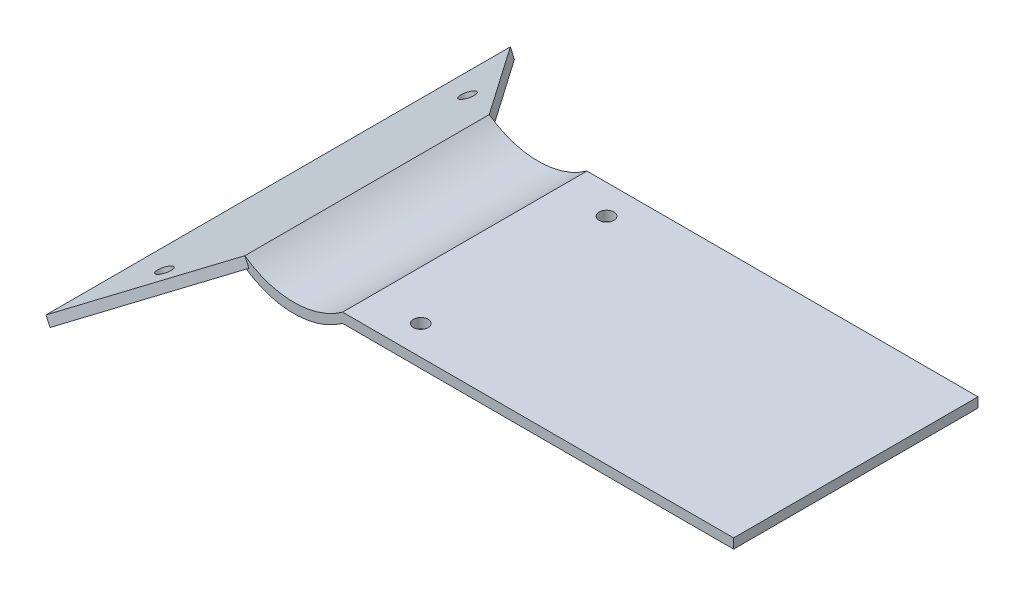
ISO-10303-21;
HEADER;
FILE_DESCRIPTION(('STEP AP214'),'2;1');
FILE_NAME('part.step','',(''),(''),'','','');
FILE_SCHEMA(('AUTOMOTIVE_DESIGN { 1 0 10303 214 1 1 1 1 }'));
ENDSEC;
DATA;
#1=APPLICATION_CONTEXT('core data for automotive mechanical design processes');
#2=APPLICATION_PROTOCOL_DEFINITION('international standard','automotive_design',2000,#1);
#3=PRODUCT_CONTEXT('',#1,'mechanical');
#4=PRODUCT('Part','Part','',(#3));
#5=PRODUCT_RELATED_PRODUCT_CATEGORY('part','',(#4));
#6=PRODUCT_DEFINITION_FORMATION('','',#4);
#7=PRODUCT_DEFINITION_CONTEXT('part definition',#1,'design');
#8=PRODUCT_DEFINITION('design','',#6,#7);
#9=PRODUCT_DEFINITION_SHAPE('','',#8);
#10=(LENGTH_UNIT() NAMED_UNIT(*) SI_UNIT(.MILLI.,.METRE.));
#11=(NAMED_UNIT(*) PLANE_ANGLE_UNIT() SI_UNIT($,.RADIAN.));
#12=(NAMED_UNIT(*) SI_UNIT($,.STERADIAN.) SOLID_ANGLE_UNIT());
#13=UNCERTAINTY_MEASURE_WITH_UNIT(LENGTH_MEASURE(1.E-05),#10,'distance_accuracy_value','');
#14=(GEOMETRIC_REPRESENTATION_CONTEXT(3) GLOBAL_UNCERTAINTY_ASSIGNED_CONTEXT((#13)) GLOBAL_UNIT_ASSIGNED_CONTEXT((#10,
#11,#12)) REPRESENTATION_CONTEXT('',''));
#15=CARTESIAN_POINT('',(0.,0.,0.));
#16=DIRECTION('',(0.,0.,1.));
#17=DIRECTION('',(1.,0.,0.));
#18=AXIS2_PLACEMENT_3D('',#15,#16,#17);
#19=CARTESIAN_POINT('',(-215.409015853351,9.9999999999999,500.));
#20=DIRECTION('',(0.,-1.,0.));
#21=DIRECTION('',(1.,0.,0.));
#22=AXIS2_PLACEMENT_3D('',#19,#20,#21);
#23=PLANE('',#22);
#24=DIRECTION('',(-1.,0.,0.));
#25=VECTOR('',#24,1.);
#26=CARTESIAN_POINT('',(-215.409015853351,9.9999999999999,0.));
#27=LINE('',#26,#25);
#28=CARTESIAN_POINT('',(400.,10.,0.));
#29=VERTEX_POINT('',#28);
#30=CARTESIAN_POINT('',(-400.,9.99999999999988,0.));
#31=VERTEX_POINT('',#30);
#32=EDGE_CURVE('E128',#29,#31,#27,.T.);
#33=ORIENTED_EDGE('',*,*,#32,.T.);
#34=DIRECTION('',(0.,0.,-1.));
#35=VECTOR('',#34,1.);
#36=CARTESIAN_POINT('',(-400.,9.99999999999988,500.));
#37=LINE('',#36,#35);
#38=CARTESIAN_POINT('',(-400.,9.99999999999988,500.));
#39=VERTEX_POINT('',#38);
#40=EDGE_CURVE('E160',#39,#31,#37,.T.);
#41=ORIENTED_EDGE('',*,*,#40,.F.);
#42=DIRECTION('',(-1.,0.,0.));
#43=VECTOR('',#42,1.);
#44=CARTESIAN_POINT('',(-215.409015853351,9.9999999999999,500.));
#45=LINE('',#44,#43);
#46=CARTESIAN_POINT('',(400.,10.,500.));
#47=VERTEX_POINT('',#46);
#48=EDGE_CURVE('E84',#47,#39,#45,.T.);
#49=ORIENTED_EDGE('',*,*,#48,.F.);
#50=DIRECTION('',(0.,0.,-1.));
#51=VECTOR('',#50,1.);
#52=CARTESIAN_POINT('',(400.,10.,500.));
#53=LINE('',#52,#51);
#54=EDGE_CURVE('E123',#47,#29,#53,.T.);
#55=ORIENTED_EDGE('',*,*,#54,.T.);
#56=EDGE_LOOP('',(#33,#41,#49,#55));
#57=FACE_BOUND('',#56,.T.);
#58=CARTESIAN_POINT('',(-300.,9.99999999999989,60.));
#59=DIRECTION('',(0.,1.,0.));
#60=DIRECTION('',(-1.,0.,0.));
#61=AXIS2_PLACEMENT_3D('',#58,#59,#60);
#62=CIRCLE('',#61,15.);
#63=CARTESIAN_POINT('',(-315.,9.99999999999989,60.));
#64=VERTEX_POINT('',#63);
#65=EDGE_CURVE('E165',#64,#64,#62,.T.);
#66=ORIENTED_EDGE('',*,*,#65,.F.);
#67=EDGE_LOOP('',(#66));
#68=FACE_BOUND('',#67,.T.);
#69=CARTESIAN_POINT('',(-300.,9.99999999999989,440.));
#70=DIRECTION('',(0.,1.,0.));
#71=DIRECTION('',(-1.,0.,0.));
#72=AXIS2_PLACEMENT_3D('',#69,#70,#71);
#73=CIRCLE('',#72,15.);
#74=CARTESIAN_POINT('',(-315.,9.99999999999989,440.));
#75=VERTEX_POINT('',#74);
#76=EDGE_CURVE('E176',#75,#75,#73,.F.);
#77=ORIENTED_EDGE('',*,*,#76,.T.);
#78=EDGE_LOOP('',(#77));
#79=FACE_BOUND('',#78,.T.);
#80=ADVANCED_FACE('F33',(#57,#68,#79),#23,.F.);
#81=CARTESIAN_POINT('',(-215.409015853351,-10.,500.));
#82=DIRECTION('',(0.,-1.,0.));
#83=DIRECTION('',(1.,0.,0.));
#84=AXIS2_PLACEMENT_3D('',#81,#82,#83);
#85=PLANE('',#84);
#86=DIRECTION('',(-1.,0.,0.));
#87=VECTOR('',#86,1.);
#88=CARTESIAN_POINT('',(-215.409015853351,-10.,0.));
#89=LINE('',#88,#87);
#90=CARTESIAN_POINT('',(400.,-9.99999999999993,0.));
#91=VERTEX_POINT('',#90);
#92=CARTESIAN_POINT('',(-400.,-10.,0.));
#93=VERTEX_POINT('',#92);
#94=EDGE_CURVE('E144',#91,#93,#89,.T.);
#95=ORIENTED_EDGE('',*,*,#94,.F.);
#96=DIRECTION('',(0.,0.,-1.));
#97=VECTOR('',#96,1.);
#98=CARTESIAN_POINT('',(400.,-9.99999999999993,500.));
#99=LINE('',#98,#97);
#100=CARTESIAN_POINT('',(400.,-9.99999999999993,500.));
#101=VERTEX_POINT('',#100);
#102=EDGE_CURVE('E75',#101,#91,#99,.T.);
#103=ORIENTED_EDGE('',*,*,#102,.F.);
#104=DIRECTION('',(-1.,0.,0.));
#105=VECTOR('',#104,1.);
#106=CARTESIAN_POINT('',(-215.409015853351,-10.,500.));
#107=LINE('',#106,#105);
#108=CARTESIAN_POINT('',(-400.,-10.,500.));
#109=VERTEX_POINT('',#108);
#110=EDGE_CURVE('E101',#101,#109,#107,.T.);
#111=ORIENTED_EDGE('',*,*,#110,.T.);
#112=DIRECTION('',(0.,0.,-1.));
#113=VECTOR('',#112,1.);
#114=CARTESIAN_POINT('',(-400.,-10.,500.));
#115=LINE('',#114,#113);
#116=EDGE_CURVE('E110',#109,#93,#115,.T.);
#117=ORIENTED_EDGE('',*,*,#116,.T.);
#118=EDGE_LOOP('',(#95,#103,#111,#117));
#119=FACE_BOUND('',#118,.T.);
#120=CARTESIAN_POINT('',(-300.,-10.,60.));
#121=DIRECTION('',(0.,-1.,0.));
#122=DIRECTION('',(1.,0.,0.));
#123=AXIS2_PLACEMENT_3D('',#120,#121,#122);
#124=CIRCLE('',#123,15.);
#125=CARTESIAN_POINT('',(-285.,-10.,60.));
#126=VERTEX_POINT('',#125);
#127=EDGE_CURVE('E162',#126,#126,#124,.T.);
#128=ORIENTED_EDGE('',*,*,#127,.F.);
#129=EDGE_LOOP('',(#128));
#130=FACE_BOUND('',#129,.T.);
#131=CARTESIAN_POINT('',(-300.,-10.,440.));
#132=DIRECTION('',(0.,-1.,0.));
#133=DIRECTION('',(1.,0.,0.));
#134=AXIS2_PLACEMENT_3D('',#131,#132,#133);
#135=CIRCLE('',#134,15.);
#136=CARTESIAN_POINT('',(-285.,-10.,440.));
#137=VERTEX_POINT('',#136);
#138=EDGE_CURVE('E36',#137,#137,#135,.F.);
#139=ORIENTED_EDGE('',*,*,#138,.T.);
#140=EDGE_LOOP('',(#139));
#141=FACE_BOUND('',#140,.T.);
#142=ADVANCED_FACE('F120',(#119,#130,#141),#85,.T.);
#143=CARTESIAN_POINT('',(-215.409015853351,-969.886426697641,0.));
#144=DIRECTION('',(0.,0.,1.));
#145=DIRECTION('',(1.,0.,0.));
#146=AXIS2_PLACEMENT_3D('',#143,#144,#145);
#147=PLANE('',#146);
#148=DIRECTION('',(-0.416666666666667,0.909059342886309,0.));
#149=VECTOR('',#148,1.);
#150=CARTESIAN_POINT('',(-773.478535243929,-91.5145201910597,0.));
#151=LINE('',#150,#149);
#152=CARTESIAN_POINT('',(-774.236374053209,-89.8611111111113,0.));
#153=VERTEX_POINT('',#152);
#154=CARTESIAN_POINT('',(-781.811868577262,-73.3333333333335,0.));
#155=VERTEX_POINT('',#154);
#156=EDGE_CURVE('E11',#153,#155,#151,.T.);
#157=ORIENTED_EDGE('',*,*,#156,.F.);
#158=DIRECTION('',(-0.90905934288631,-0.416666666666667,0.));
#159=VECTOR('',#158,1.);
#160=CARTESIAN_POINT('',(-645.759002392385,-30.9736043593051,0.));
#161=LINE('',#160,#159);
#162=CARTESIAN_POINT('',(-818.174242292714,-110.,0.));
#163=VERTEX_POINT('',#162);
#164=EDGE_CURVE('E138',#153,#163,#161,.T.);
#165=ORIENTED_EDGE('',*,*,#164,.T.);
#166=DIRECTION('',(-0.704154339142587,-0.710046946804693,0.));
#167=VECTOR('',#166,1.);
#168=CARTESIAN_POINT('',(-949.231435355701,-242.153925096134,0.));
#169=LINE('',#168,#167);
#170=EDGE_CURVE('E135',#155,#163,#169,.T.);
#171=ORIENTED_EDGE('',*,*,#170,.F.);
#172=EDGE_LOOP('',(#157,#165,#171));
#173=FACE_BOUND('',#172,.T.);
#174=ADVANCED_FACE('F261',(#173),#147,.F.);
#175=DIRECTION('',(-0.909059342886309,-0.416666666666667,0.));
#176=VECTOR('',#175,1.);
#177=CARTESIAN_POINT('',(-1368.37615592177,-364.185397571579,0.));
#178=LINE('',#177,#176);
#179=CARTESIAN_POINT('',(-591.666666666667,-8.18118685772623,0.));
#180=VERTEX_POINT('',#179);
#181=CARTESIAN_POINT('',(-598.299201498949,-11.2212042138465,0.));
#182=VERTEX_POINT('',#181);
#183=EDGE_CURVE('E190',#180,#182,#178,.T.);
#184=ORIENTED_EDGE('',*,*,#183,.F.);
#185=DIRECTION('',(-0.416666666666667,0.909059342886309,0.));
#186=VECTOR('',#185,1.);
#187=CARTESIAN_POINT('',(-591.666666666667,-8.18118685772623,0.));
#188=LINE('',#187,#186);
#189=CARTESIAN_POINT('',(-600.,9.9999999999999,0.));
#190=VERTEX_POINT('',#189);
#191=EDGE_CURVE('E198',#180,#190,#188,.T.);
#192=ORIENTED_EDGE('',*,*,#191,.T.);
#193=CARTESIAN_POINT('',(-500.,147.477270848675,0.));
#194=DIRECTION('',(0.,0.,1.));
#195=DIRECTION('',(1.,0.,0.));
#196=AXIS2_PLACEMENT_3D('',#193,#194,#195);
#197=CIRCLE('',#196,170.);
#198=EDGE_CURVE('E131',#190,#31,#197,.T.);
#199=ORIENTED_EDGE('',*,*,#198,.T.);
#200=ORIENTED_EDGE('',*,*,#32,.F.);
#201=DIRECTION('',(0.,1.,0.));
#202=VECTOR('',#201,1.);
#203=CARTESIAN_POINT('',(400.,-969.886426697641,0.));
#204=LINE('',#203,#202);
#205=EDGE_CURVE('E78',#91,#29,#204,.T.);
#206=ORIENTED_EDGE('',*,*,#205,.F.);
#207=ORIENTED_EDGE('',*,*,#94,.T.);
#208=CARTESIAN_POINT('',(-500.,127.477270848675,0.));
#209=DIRECTION('',(0.,0.,1.));
#210=DIRECTION('',(1.,0.,0.));
#211=AXIS2_PLACEMENT_3D('',#208,#209,#210);
#212=CIRCLE('',#211,170.);
#213=EDGE_CURVE('E114',#182,#93,#212,.T.);
#214=ORIENTED_EDGE('',*,*,#213,.F.);
#215=EDGE_LOOP('',(#184,#192,#199,#200,#206,#207,#214));
#216=FACE_BOUND('',#215,.T.);
#217=ADVANCED_FACE('F309',(#216),#147,.F.);
#218=CARTESIAN_POINT('',(-215.409015853351,-969.886426697641,500.));
#219=DIRECTION('',(0.,0.,1.));
#220=DIRECTION('',(1.,0.,0.));
#221=AXIS2_PLACEMENT_3D('',#218,#219,#220);
#222=PLANE('',#221);
#223=DIRECTION('',(-0.90905934288631,-0.416666666666667,0.));
#224=VECTOR('',#223,1.);
#225=CARTESIAN_POINT('',(-645.759002392385,-30.9736043593051,500.));
#226=LINE('',#225,#224);
#227=CARTESIAN_POINT('',(-774.236374053209,-89.8611111111113,500.));
#228=VERTEX_POINT('',#227);
#229=CARTESIAN_POINT('',(-818.174242292714,-110.,500.));
#230=VERTEX_POINT('',#229);
#231=EDGE_CURVE('E238',#228,#230,#226,.T.);
#232=ORIENTED_EDGE('',*,*,#231,.F.);
#233=DIRECTION('',(-0.416666666666667,0.909059342886309,0.));
#234=VECTOR('',#233,1.);
#235=CARTESIAN_POINT('',(-773.478535243929,-91.5145201910596,500.));
#236=LINE('',#235,#234);
#237=CARTESIAN_POINT('',(-781.811868577262,-73.3333333333335,500.));
#238=VERTEX_POINT('',#237);
#239=EDGE_CURVE('E161',#228,#238,#236,.T.);
#240=ORIENTED_EDGE('',*,*,#239,.T.);
#241=DIRECTION('',(-0.704154339142587,-0.710046946804693,0.));
#242=VECTOR('',#241,1.);
#243=CARTESIAN_POINT('',(-949.231435355701,-242.153925096134,500.));
#244=LINE('',#243,#242);
#245=EDGE_CURVE('E236',#238,#230,#244,.T.);
#246=ORIENTED_EDGE('',*,*,#245,.T.);
#247=EDGE_LOOP('',(#232,#240,#246));
#248=FACE_BOUND('',#247,.T.);
#249=ADVANCED_FACE('F252',(#248),#222,.T.);
#250=CARTESIAN_POINT('',(-500.,147.477270848675,500.));
#251=DIRECTION('',(0.,0.,-1.));
#252=DIRECTION('',(-1.,0.,0.));
#253=AXIS2_PLACEMENT_3D('',#250,#251,#252);
#254=CYLINDRICAL_SURFACE('',#253,170.);
#255=ORIENTED_EDGE('',*,*,#198,.F.);
#256=DIRECTION('',(0.,0.,-1.));
#257=VECTOR('',#256,1.);
#258=CARTESIAN_POINT('',(-600.,9.9999999999999,500.));
#259=LINE('',#258,#257);
#260=CARTESIAN_POINT('',(-600.,9.99999999999995,500.));
#261=VERTEX_POINT('',#260);
#262=EDGE_CURVE('E157',#261,#190,#259,.T.);
#263=ORIENTED_EDGE('',*,*,#262,.F.);
#264=CARTESIAN_POINT('',(-500.,147.477270848675,500.));
#265=DIRECTION('',(0.,0.,1.));
#266=DIRECTION('',(1.,0.,0.));
#267=AXIS2_PLACEMENT_3D('',#264,#265,#266);
#268=CIRCLE('',#267,170.);
#269=EDGE_CURVE('E233',#261,#39,#268,.T.);
#270=ORIENTED_EDGE('',*,*,#269,.T.);
#271=ORIENTED_EDGE('',*,*,#40,.T.);
#272=EDGE_LOOP('',(#255,#263,#270,#271));
#273=FACE_BOUND('',#272,.T.);
#274=ADVANCED_FACE('F340',(#273),#254,.F.);
#275=CARTESIAN_POINT('',(-653.334496916438,-14.4458265815273,500.));
#276=DIRECTION('',(0.416666666666667,-0.909059342886309,0.));
#277=DIRECTION('',(0.909059342886309,0.416666666666667,0.));
#278=AXIS2_PLACEMENT_3D('',#275,#276,#277);
#279=PLANE('',#278);
#280=ORIENTED_EDGE('',*,*,#262,.T.);
#281=DIRECTION('',(-0.603946154764153,-0.276818266179133,-0.74740931868366));
#282=VECTOR('',#281,1.);
#283=CARTESIAN_POINT('',(-813.752809149338,-87.973439441378,-264.52828649172));
#284=LINE('',#283,#282);
#285=CARTESIAN_POINT('',(-781.811868577262,-73.3333333333335,-225.));
#286=VERTEX_POINT('',#285);
#287=EDGE_CURVE('E169',#190,#286,#284,.T.);
#288=ORIENTED_EDGE('',*,*,#287,.T.);
#289=DIRECTION('',(0.,0.,1.));
#290=VECTOR('',#289,1.);
#291=CARTESIAN_POINT('',(-781.811868577262,-73.3333333333335,285.937358889559));
#292=LINE('',#291,#290);
#293=EDGE_CURVE('E183',#286,#155,#292,.T.);
#294=ORIENTED_EDGE('',*,*,#293,.T.);
#295=DIRECTION('',(0.,0.,-1.));
#296=VECTOR('',#295,1.);
#297=CARTESIAN_POINT('',(-781.811868577262,-73.3333333333335,500.));
#298=LINE('',#297,#296);
#299=EDGE_CURVE('E154',#238,#155,#298,.T.);
#300=ORIENTED_EDGE('',*,*,#299,.F.);
#301=DIRECTION('',(0.,0.,-1.));
#302=VECTOR('',#301,1.);
#303=CARTESIAN_POINT('',(-781.811868577262,-73.3333333333336,285.937358889559));
#304=LINE('',#303,#302);
#305=CARTESIAN_POINT('',(-781.811868577262,-73.3333333333335,725.));
#306=VERTEX_POINT('',#305);
#307=EDGE_CURVE('E221',#306,#238,#304,.T.);
#308=ORIENTED_EDGE('',*,*,#307,.F.);
#309=DIRECTION('',(-0.603946154764153,-0.276818266179133,0.74740931868366));
#310=VECTOR('',#309,1.);
#311=CARTESIAN_POINT('',(-846.19669623512,-102.844070706023,804.678990906262));
#312=LINE('',#311,#310);
#313=EDGE_CURVE('E200',#261,#306,#312,.T.);
#314=ORIENTED_EDGE('',*,*,#313,.F.);
#315=EDGE_LOOP('',(#280,#288,#294,#300,#308,#314));
#316=FACE_BOUND('',#315,.T.);
#317=CARTESIAN_POINT('',(-704.541824431926,-37.9166666666667,560.));
#318=DIRECTION('',(-0.416666666666667,0.909059342886309,0.));
#319=DIRECTION('',(-0.909059342886309,-0.416666666666667,0.));
#320=AXIS2_PLACEMENT_3D('',#317,#318,#319);
#321=CIRCLE('',#320,15.0000000000001);
#322=CARTESIAN_POINT('',(-718.17771457522,-44.1666666666668,560.));
#323=VERTEX_POINT('',#322);
#324=EDGE_CURVE('E209',#323,#323,#321,.F.);
#325=ORIENTED_EDGE('',*,*,#324,.T.);
#326=EDGE_LOOP('',(#325));
#327=FACE_BOUND('',#326,.T.);
#328=CARTESIAN_POINT('',(-704.541824431926,-37.9166666666668,-60.));
#329=DIRECTION('',(-0.416666666666667,0.909059342886309,0.));
#330=DIRECTION('',(-0.909059342886309,-0.416666666666667,0.));
#331=AXIS2_PLACEMENT_3D('',#328,#329,#330);
#332=CIRCLE('',#331,15.0000000000001);
#333=CARTESIAN_POINT('',(-718.177714575221,-44.1666666666669,-60.));
#334=VERTEX_POINT('',#333);
#335=EDGE_CURVE('E164',#334,#334,#332,.T.);
#336=ORIENTED_EDGE('',*,*,#335,.F.);
#337=EDGE_LOOP('',(#336));
#338=FACE_BOUND('',#337,.T.);
#339=ADVANCED_FACE('F338',(#316,#327,#338),#279,.F.);
#340=CARTESIAN_POINT('',(-949.231435355701,-242.153925096134,500.));
#341=DIRECTION('',(0.710046946804693,-0.704154339142587,0.));
#342=DIRECTION('',(0.704154339142587,0.710046946804693,0.));
#343=AXIS2_PLACEMENT_3D('',#340,#341,#342);
#344=PLANE('',#343);
#345=ORIENTED_EDGE('',*,*,#170,.T.);
#346=DIRECTION('',(0.,0.,-1.));
#347=VECTOR('',#346,1.);
#348=CARTESIAN_POINT('',(-818.174242292714,-110.,500.));
#349=LINE('',#348,#347);
#350=EDGE_CURVE('E151',#230,#163,#349,.T.);
#351=ORIENTED_EDGE('',*,*,#350,.F.);
#352=ORIENTED_EDGE('',*,*,#245,.F.);
#353=ORIENTED_EDGE('',*,*,#299,.T.);
#354=EDGE_LOOP('',(#345,#351,#352,#353));
#355=FACE_BOUND('',#354,.T.);
#356=ADVANCED_FACE('F256',(#355),#344,.F.);
#357=CARTESIAN_POINT('',(-645.759002392385,-30.9736043593051,500.));
#358=DIRECTION('',(0.416666666666667,-0.90905934288631,0.));
#359=DIRECTION('',(0.90905934288631,0.416666666666667,0.));
#360=AXIS2_PLACEMENT_3D('',#357,#358,#359);
#361=PLANE('',#360);
#362=CARTESIAN_POINT('',(-600.,-10.,0.));
#363=VERTEX_POINT('',#362);
#364=EDGE_CURVE('E139',#363,#153,#161,.T.);
#365=ORIENTED_EDGE('',*,*,#364,.F.);
#366=DIRECTION('',(0.,0.,-1.));
#367=VECTOR('',#366,1.);
#368=CARTESIAN_POINT('',(-600.,-10.,500.));
#369=LINE('',#368,#367);
#370=CARTESIAN_POINT('',(-600.,-10.,500.));
#371=VERTEX_POINT('',#370);
#372=EDGE_CURVE('E118',#371,#363,#369,.T.);
#373=ORIENTED_EDGE('',*,*,#372,.F.);
#374=EDGE_CURVE('E107',#371,#228,#226,.T.);
#375=ORIENTED_EDGE('',*,*,#374,.T.);
#376=ORIENTED_EDGE('',*,*,#231,.T.);
#377=ORIENTED_EDGE('',*,*,#350,.T.);
#378=ORIENTED_EDGE('',*,*,#164,.F.);
#379=EDGE_LOOP('',(#365,#373,#375,#376,#377,#378));
#380=FACE_BOUND('',#379,.T.);
#381=ADVANCED_FACE('F246',(#380),#361,.T.);
#382=CARTESIAN_POINT('',(-500.,127.477270848675,500.));
#383=DIRECTION('',(0.,0.,-1.));
#384=DIRECTION('',(-1.,0.,0.));
#385=AXIS2_PLACEMENT_3D('',#382,#383,#384);
#386=CYLINDRICAL_SURFACE('',#385,170.);
#387=EDGE_CURVE('E142',#363,#182,#212,.T.);
#388=ORIENTED_EDGE('',*,*,#387,.T.);
#389=ORIENTED_EDGE('',*,*,#213,.T.);
#390=ORIENTED_EDGE('',*,*,#116,.F.);
#391=CARTESIAN_POINT('',(-500.,127.477270848675,500.));
#392=DIRECTION('',(0.,0.,1.));
#393=DIRECTION('',(1.,0.,0.));
#394=AXIS2_PLACEMENT_3D('',#391,#392,#393);
#395=CIRCLE('',#394,170.);
#396=CARTESIAN_POINT('',(-598.299201498949,-11.2212042138465,500.));
#397=VERTEX_POINT('',#396);
#398=EDGE_CURVE('E96',#397,#109,#395,.T.);
#399=ORIENTED_EDGE('',*,*,#398,.F.);
#400=EDGE_CURVE('E106',#371,#397,#395,.T.);
#401=ORIENTED_EDGE('',*,*,#400,.F.);
#402=ORIENTED_EDGE('',*,*,#372,.T.);
#403=EDGE_LOOP('',(#388,#389,#390,#399,#401,#402));
#404=FACE_BOUND('',#403,.T.);
#405=ADVANCED_FACE('F112',(#404),#386,.T.);
#406=CARTESIAN_POINT('',(400.,-969.886426697641,500.));
#407=DIRECTION('',(-1.,0.,0.));
#408=DIRECTION('',(0.,0.,1.));
#409=AXIS2_PLACEMENT_3D('',#406,#407,#408);
#410=PLANE('',#409);
#411=ORIENTED_EDGE('',*,*,#205,.T.);
#412=ORIENTED_EDGE('',*,*,#54,.F.);
#413=DIRECTION('',(0.,1.,0.));
#414=VECTOR('',#413,1.);
#415=CARTESIAN_POINT('',(400.,-969.886426697641,500.));
#416=LINE('',#415,#414);
#417=EDGE_CURVE('E52',#101,#47,#416,.T.);
#418=ORIENTED_EDGE('',*,*,#417,.F.);
#419=ORIENTED_EDGE('',*,*,#102,.T.);
#420=EDGE_LOOP('',(#411,#412,#418,#419));
#421=FACE_BOUND('',#420,.T.);
#422=ADVANCED_FACE('F314',(#421),#410,.F.);
#423=DIRECTION('',(-0.416666666666667,0.909059342886309,0.));
#424=VECTOR('',#423,1.);
#425=CARTESIAN_POINT('',(-591.666666666667,-8.18118685772623,500.));
#426=LINE('',#425,#424);
#427=CARTESIAN_POINT('',(-591.666666666667,-8.18118685772623,500.));
#428=VERTEX_POINT('',#427);
#429=EDGE_CURVE('E218',#428,#261,#426,.T.);
#430=ORIENTED_EDGE('',*,*,#429,.F.);
#431=DIRECTION('',(0.909059342886309,0.416666666666667,0.));
#432=VECTOR('',#431,1.);
#433=CARTESIAN_POINT('',(-1368.37615592177,-364.185397571579,500.));
#434=LINE('',#433,#432);
#435=EDGE_CURVE('E42',#397,#428,#434,.T.);
#436=ORIENTED_EDGE('',*,*,#435,.F.);
#437=ORIENTED_EDGE('',*,*,#398,.T.);
#438=ORIENTED_EDGE('',*,*,#110,.F.);
#439=ORIENTED_EDGE('',*,*,#417,.T.);
#440=ORIENTED_EDGE('',*,*,#48,.T.);
#441=ORIENTED_EDGE('',*,*,#269,.F.);
#442=EDGE_LOOP('',(#430,#436,#437,#438,#439,#440,#441));
#443=FACE_BOUND('',#442,.T.);
#444=ADVANCED_FACE('F99',(#443),#222,.T.);
#445=CARTESIAN_POINT('',(-837.863362901787,-121.025257563749,804.678990906262));
#446=DIRECTION('',(-0.679439424109672,-0.311420549451525,-0.66436383882992));
#447=DIRECTION('',(-0.699130042430675,0.,0.71499453408462));
#448=AXIS2_PLACEMENT_3D('',#445,#446,#447);
#449=PLANE('',#448);
#450=ORIENTED_EDGE('',*,*,#313,.T.);
#451=DIRECTION('',(-0.416666666666667,0.909059342886309,0.));
#452=VECTOR('',#451,1.);
#453=CARTESIAN_POINT('',(-773.478535243929,-91.5145201910597,725.));
#454=LINE('',#453,#452);
#455=CARTESIAN_POINT('',(-773.478535243929,-91.5145201910597,725.));
#456=VERTEX_POINT('',#455);
#457=EDGE_CURVE('E132',#456,#306,#454,.T.);
#458=ORIENTED_EDGE('',*,*,#457,.F.);
#459=DIRECTION('',(-0.603946154764153,-0.276818266179133,0.74740931868366));
#460=VECTOR('',#459,1.);
#461=CARTESIAN_POINT('',(-837.863362901787,-121.025257563749,804.678990906262));
#462=LINE('',#461,#460);
#463=EDGE_CURVE('E205',#428,#456,#462,.T.);
#464=ORIENTED_EDGE('',*,*,#463,.F.);
#465=ORIENTED_EDGE('',*,*,#429,.T.);
#466=EDGE_LOOP('',(#450,#458,#464,#465));
#467=FACE_BOUND('',#466,.T.);
#468=ADVANCED_FACE('F321',(#467),#449,.F.);
#469=CARTESIAN_POINT('',(-773.478535243929,-91.5145201910598,285.937358889559));
#470=DIRECTION('',(0.909059342886309,0.416666666666667,0.));
#471=DIRECTION('',(-0.416666666666667,0.909059342886309,0.));
#472=AXIS2_PLACEMENT_3D('',#469,#470,#471);
#473=PLANE('',#472);
#474=ORIENTED_EDGE('',*,*,#307,.T.);
#475=ORIENTED_EDGE('',*,*,#239,.F.);
#476=CARTESIAN_POINT('',(-773.478535243929,-91.5145201910596,500.));
#477=VERTEX_POINT('',#476);
#478=EDGE_CURVE('E227',#477,#228,#236,.T.);
#479=ORIENTED_EDGE('',*,*,#478,.F.);
#480=DIRECTION('',(0.,0.,-1.));
#481=VECTOR('',#480,1.);
#482=CARTESIAN_POINT('',(-773.478535243929,-91.5145201910598,285.937358889559));
#483=LINE('',#482,#481);
#484=EDGE_CURVE('E212',#456,#477,#483,.T.);
#485=ORIENTED_EDGE('',*,*,#484,.F.);
#486=ORIENTED_EDGE('',*,*,#457,.T.);
#487=EDGE_LOOP('',(#474,#475,#479,#485,#486));
#488=FACE_BOUND('',#487,.T.);
#489=ADVANCED_FACE('F353',(#488),#473,.F.);
#490=CARTESIAN_POINT('',(-1368.37615592177,-364.185397571579,500.));
#491=DIRECTION('',(0.,0.,1.));
#492=DIRECTION('',(1.,0.,0.));
#493=AXIS2_PLACEMENT_3D('',#490,#491,#492);
#494=PLANE('',#493);
#495=ORIENTED_EDGE('',*,*,#374,.F.);
#496=ORIENTED_EDGE('',*,*,#400,.T.);
#497=EDGE_CURVE('E208',#477,#397,#434,.T.);
#498=ORIENTED_EDGE('',*,*,#497,.F.);
#499=ORIENTED_EDGE('',*,*,#478,.T.);
#500=EDGE_LOOP('',(#495,#496,#498,#499));
#501=FACE_BOUND('',#500,.T.);
#502=ADVANCED_FACE('F297',(#501),#494,.F.);
#503=CARTESIAN_POINT('',(-696.208491098592,-56.0978535243929,560.));
#504=DIRECTION('',(-0.416666666666667,0.909059342886309,0.));
#505=DIRECTION('',(-0.909059342886309,-0.416666666666667,0.));
#506=AXIS2_PLACEMENT_3D('',#503,#504,#505);
#507=CYLINDRICAL_SURFACE('',#506,15.0000000000001);
#508=CARTESIAN_POINT('',(-696.208491098592,-56.0978535243929,560.));
#509=DIRECTION('',(-0.416666666666667,0.909059342886309,0.));
#510=DIRECTION('',(-0.909059342886309,-0.416666666666667,0.));
#511=AXIS2_PLACEMENT_3D('',#508,#509,#510);
#512=CIRCLE('',#511,15.0000000000001);
#513=CARTESIAN_POINT('',(-709.844381241887,-62.3478535243929,560.));
#514=VERTEX_POINT('',#513);
#515=EDGE_CURVE('E215',#514,#514,#512,.F.);
#516=ORIENTED_EDGE('',*,*,#515,.T.);
#517=EDGE_LOOP('',(#516));
#518=FACE_BOUND('',#517,.T.);
#519=ORIENTED_EDGE('',*,*,#324,.F.);
#520=EDGE_LOOP('',(#519));
#521=FACE_BOUND('',#520,.T.);
#522=ADVANCED_FACE('F359',(#518,#521),#507,.F.);
#523=CARTESIAN_POINT('',(-1368.37615592177,-364.185397571579,285.937358889559));
#524=DIRECTION('',(-0.416666666666667,0.909059342886309,0.));
#525=DIRECTION('',(-0.909059342886309,-0.416666666666667,0.));
#526=AXIS2_PLACEMENT_3D('',#523,#524,#525);
#527=PLANE('',#526);
#528=ORIENTED_EDGE('',*,*,#463,.T.);
#529=ORIENTED_EDGE('',*,*,#484,.T.);
#530=ORIENTED_EDGE('',*,*,#497,.T.);
#531=ORIENTED_EDGE('',*,*,#435,.T.);
#532=EDGE_LOOP('',(#528,#529,#530,#531));
#533=FACE_BOUND('',#532,.T.);
#534=ORIENTED_EDGE('',*,*,#515,.F.);
#535=EDGE_LOOP('',(#534));
#536=FACE_BOUND('',#535,.T.);
#537=ADVANCED_FACE('F355',(#533,#536),#527,.F.);
#538=CARTESIAN_POINT('',(-805.419475816004,-106.154626299104,-264.52828649172));
#539=DIRECTION('',(0.679439424109672,0.311420549451525,-0.66436383882992));
#540=DIRECTION('',(-0.699130042430675,0.,-0.71499453408462));
#541=AXIS2_PLACEMENT_3D('',#538,#539,#540);
#542=PLANE('',#541);
#543=ORIENTED_EDGE('',*,*,#287,.F.);
#544=ORIENTED_EDGE('',*,*,#191,.F.);
#545=DIRECTION('',(-0.603946154764153,-0.276818266179133,-0.74740931868366));
#546=VECTOR('',#545,1.);
#547=CARTESIAN_POINT('',(-805.419475816004,-106.154626299104,-264.52828649172));
#548=LINE('',#547,#546);
#549=CARTESIAN_POINT('',(-773.478535243929,-91.5145201910596,-225.));
#550=VERTEX_POINT('',#549);
#551=EDGE_CURVE('E182',#180,#550,#548,.T.);
#552=ORIENTED_EDGE('',*,*,#551,.T.);
#553=DIRECTION('',(-0.416666666666667,0.909059342886309,0.));
#554=VECTOR('',#553,1.);
#555=CARTESIAN_POINT('',(-773.478535243929,-91.5145201910596,-225.));
#556=LINE('',#555,#554);
#557=EDGE_CURVE('E192',#550,#286,#556,.T.);
#558=ORIENTED_EDGE('',*,*,#557,.T.);
#559=EDGE_LOOP('',(#543,#544,#552,#558));
#560=FACE_BOUND('',#559,.T.);
#561=ADVANCED_FACE('F358',(#560),#542,.T.);
#562=CARTESIAN_POINT('',(-1368.37615592177,-364.185397571579,0.));
#563=DIRECTION('',(0.,0.,-1.));
#564=DIRECTION('',(-1.,0.,0.));
#565=AXIS2_PLACEMENT_3D('',#562,#563,#564);
#566=PLANE('',#565);
#567=ORIENTED_EDGE('',*,*,#387,.F.);
#568=ORIENTED_EDGE('',*,*,#364,.T.);
#569=CARTESIAN_POINT('',(-773.478535243929,-91.5145201910597,0.));
#570=VERTEX_POINT('',#569);
#571=EDGE_CURVE('E44',#570,#153,#151,.T.);
#572=ORIENTED_EDGE('',*,*,#571,.F.);
#573=EDGE_CURVE('E189',#182,#570,#178,.T.);
#574=ORIENTED_EDGE('',*,*,#573,.F.);
#575=EDGE_LOOP('',(#567,#568,#572,#574));
#576=FACE_BOUND('',#575,.T.);
#577=ADVANCED_FACE('F300',(#576),#566,.F.);
#578=CARTESIAN_POINT('',(-696.208491098593,-56.097853524393,-60.));
#579=DIRECTION('',(-0.416666666666667,0.909059342886309,0.));
#580=DIRECTION('',(-0.909059342886309,-0.416666666666667,0.));
#581=AXIS2_PLACEMENT_3D('',#578,#579,#580);
#582=CYLINDRICAL_SURFACE('',#581,15.0000000000001);
#583=CARTESIAN_POINT('',(-696.208491098593,-56.097853524393,-60.));
#584=DIRECTION('',(-0.416666666666667,0.909059342886309,0.));
#585=DIRECTION('',(-0.909059342886309,-0.416666666666667,0.));
#586=AXIS2_PLACEMENT_3D('',#583,#584,#585);
#587=CIRCLE('',#586,15.0000000000001);
#588=CARTESIAN_POINT('',(-709.844381241887,-62.347853524393,-60.));
#589=VERTEX_POINT('',#588);
#590=EDGE_CURVE('E179',#589,#589,#587,.T.);
#591=ORIENTED_EDGE('',*,*,#590,.F.);
#592=EDGE_LOOP('',(#591));
#593=FACE_BOUND('',#592,.T.);
#594=ORIENTED_EDGE('',*,*,#335,.T.);
#595=EDGE_LOOP('',(#594));
#596=FACE_BOUND('',#595,.T.);
#597=ADVANCED_FACE('F370',(#593,#596),#582,.F.);
#598=CARTESIAN_POINT('',(-773.478535243929,-91.5145201910597,285.937358889559));
#599=DIRECTION('',(-0.909059342886309,-0.416666666666667,0.));
#600=DIRECTION('',(0.416666666666667,-0.909059342886309,0.));
#601=AXIS2_PLACEMENT_3D('',#598,#599,#600);
#602=PLANE('',#601);
#603=ORIENTED_EDGE('',*,*,#293,.F.);
#604=ORIENTED_EDGE('',*,*,#557,.F.);
#605=DIRECTION('',(0.,0.,1.));
#606=VECTOR('',#605,1.);
#607=CARTESIAN_POINT('',(-773.478535243929,-91.5145201910597,285.937358889559));
#608=LINE('',#607,#606);
#609=EDGE_CURVE('E186',#550,#570,#608,.T.);
#610=ORIENTED_EDGE('',*,*,#609,.T.);
#611=ORIENTED_EDGE('',*,*,#571,.T.);
#612=ORIENTED_EDGE('',*,*,#156,.T.);
#613=EDGE_LOOP('',(#603,#604,#610,#611,#612));
#614=FACE_BOUND('',#613,.T.);
#615=ADVANCED_FACE('F372',(#614),#602,.T.);
#616=CARTESIAN_POINT('',(-1368.37615592177,-364.185397571579,285.937358889559));
#617=DIRECTION('',(-0.416666666666667,0.909059342886309,0.));
#618=DIRECTION('',(-0.909059342886309,-0.416666666666667,0.));
#619=AXIS2_PLACEMENT_3D('',#616,#617,#618);
#620=PLANE('',#619);
#621=ORIENTED_EDGE('',*,*,#590,.T.);
#622=EDGE_LOOP('',(#621));
#623=FACE_BOUND('',#622,.T.);
#624=ORIENTED_EDGE('',*,*,#551,.F.);
#625=ORIENTED_EDGE('',*,*,#183,.T.);
#626=ORIENTED_EDGE('',*,*,#573,.T.);
#627=ORIENTED_EDGE('',*,*,#609,.F.);
#628=EDGE_LOOP('',(#624,#625,#626,#627));
#629=FACE_BOUND('',#628,.T.);
#630=ADVANCED_FACE('F307',(#623,#629),#620,.F.);
#631=CARTESIAN_POINT('',(-300.,-110.,60.));
#632=DIRECTION('',(0.,1.,0.));
#633=DIRECTION('',(-1.,0.,0.));
#634=AXIS2_PLACEMENT_3D('',#631,#632,#633);
#635=CYLINDRICAL_SURFACE('',#634,15.);
#636=ORIENTED_EDGE('',*,*,#127,.T.);
#637=EDGE_LOOP('',(#636));
#638=FACE_BOUND('',#637,.T.);
#639=ORIENTED_EDGE('',*,*,#65,.T.);
#640=EDGE_LOOP('',(#639));
#641=FACE_BOUND('',#640,.T.);
#642=ADVANCED_FACE('F437',(#638,#641),#635,.F.);
#643=CARTESIAN_POINT('',(-300.,-110.,440.));
#644=DIRECTION('',(0.,1.,0.));
#645=DIRECTION('',(-1.,0.,0.));
#646=AXIS2_PLACEMENT_3D('',#643,#644,#645);
#647=CYLINDRICAL_SURFACE('',#646,15.);
#648=ORIENTED_EDGE('',*,*,#138,.F.);
#649=EDGE_LOOP('',(#648));
#650=FACE_BOUND('',#649,.T.);
#651=ORIENTED_EDGE('',*,*,#76,.F.);
#652=EDGE_LOOP('',(#651));
#653=FACE_BOUND('',#652,.T.);
#654=ADVANCED_FACE('F456',(#650,#653),#647,.F.);
#655=CLOSED_SHELL('',(#80,#142,#174,#217,#249,#274,#339,#356,#381,#405,#422,#444,#468,#489,#502,
#522,#537,#561,#577,#597,#615,#630,#642,#654));
#656=MANIFOLD_SOLID_BREP('B2',#655);
#657=ADVANCED_BREP_SHAPE_REPRESENTATION('',(#18,#656),#14);
#658=SHAPE_DEFINITION_REPRESENTATION(#9,#657);
ENDSEC;
END-ISO-10303-21;
